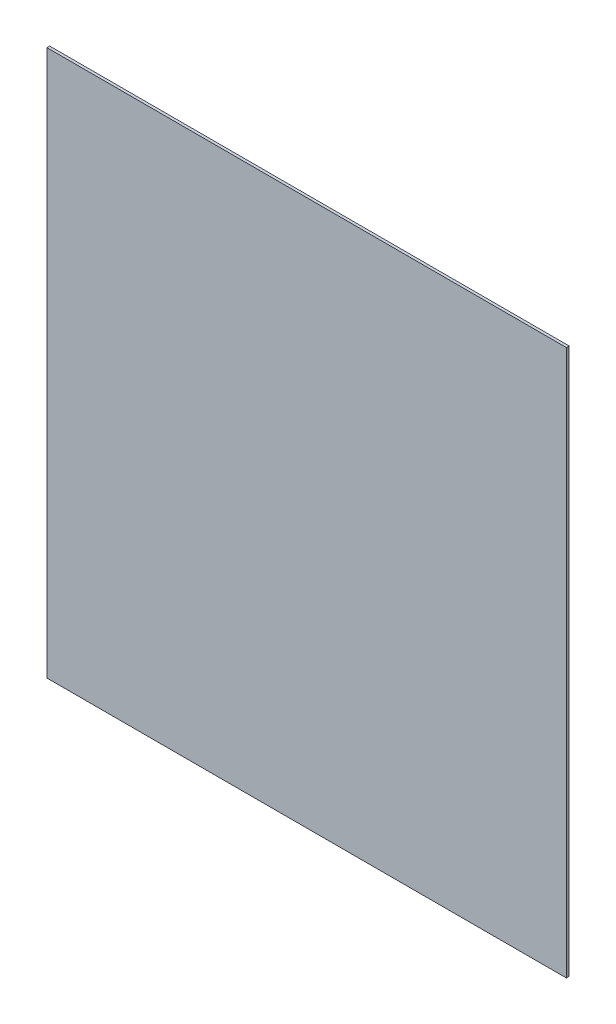
ISO-10303-21;
HEADER;
FILE_DESCRIPTION(('STEP AP214'),'2;1');
FILE_NAME('part.step','',(''),(''),'','','');
FILE_SCHEMA(('AUTOMOTIVE_DESIGN { 1 0 10303 214 1 1 1 1 }'));
ENDSEC;
DATA;
#1=APPLICATION_CONTEXT('core data for automotive mechanical design processes');
#2=APPLICATION_PROTOCOL_DEFINITION('international standard','automotive_design',2000,#1);
#3=PRODUCT_CONTEXT('',#1,'mechanical');
#4=PRODUCT('Part','Part','',(#3));
#5=PRODUCT_RELATED_PRODUCT_CATEGORY('part','',(#4));
#6=PRODUCT_DEFINITION_FORMATION('','',#4);
#7=PRODUCT_DEFINITION_CONTEXT('part definition',#1,'design');
#8=PRODUCT_DEFINITION('design','',#6,#7);
#9=PRODUCT_DEFINITION_SHAPE('','',#8);
#10=(LENGTH_UNIT() NAMED_UNIT(*) SI_UNIT(.MILLI.,.METRE.));
#11=(NAMED_UNIT(*) PLANE_ANGLE_UNIT() SI_UNIT($,.RADIAN.));
#12=(NAMED_UNIT(*) SI_UNIT($,.STERADIAN.) SOLID_ANGLE_UNIT());
#13=UNCERTAINTY_MEASURE_WITH_UNIT(LENGTH_MEASURE(1.E-05),#10,'distance_accuracy_value','');
#14=(GEOMETRIC_REPRESENTATION_CONTEXT(3) GLOBAL_UNCERTAINTY_ASSIGNED_CONTEXT((#13)) GLOBAL_UNIT_ASSIGNED_CONTEXT((#10,
#11,#12)) REPRESENTATION_CONTEXT('',''));
#15=CARTESIAN_POINT('',(0.,0.,0.));
#16=DIRECTION('',(0.,0.,1.));
#17=DIRECTION('',(1.,0.,0.));
#18=AXIS2_PLACEMENT_3D('',#15,#16,#17);
#19=CARTESIAN_POINT('',(-500.,-1008.,-5.));
#20=DIRECTION('',(-1.,0.,0.));
#21=DIRECTION('',(0.,0.,1.));
#22=AXIS2_PLACEMENT_3D('',#19,#20,#21);
#23=PLANE('',#22);
#24=DIRECTION('',(0.,-1.,0.));
#25=VECTOR('',#24,1.);
#26=CARTESIAN_POINT('',(-500.,-1008.,0.));
#27=LINE('',#26,#25);
#28=CARTESIAN_POINT('',(-500.,-8.,0.));
#29=VERTEX_POINT('',#28);
#30=CARTESIAN_POINT('',(-500.,-1008.,0.));
#31=VERTEX_POINT('',#30);
#32=EDGE_CURVE('E95',#29,#31,#27,.T.);
#33=ORIENTED_EDGE('',*,*,#32,.F.);
#34=DIRECTION('',(0.,0.,1.));
#35=VECTOR('',#34,1.);
#36=CARTESIAN_POINT('',(-500.,-8.,-5.));
#37=LINE('',#36,#35);
#38=CARTESIAN_POINT('',(-500.,-8.,-5.));
#39=VERTEX_POINT('',#38);
#40=EDGE_CURVE('E11',#39,#29,#37,.T.);
#41=ORIENTED_EDGE('',*,*,#40,.F.);
#42=DIRECTION('',(0.,-1.,0.));
#43=VECTOR('',#42,1.);
#44=CARTESIAN_POINT('',(-500.,-1008.,-5.));
#45=LINE('',#44,#43);
#46=CARTESIAN_POINT('',(-500.,-1008.,-5.));
#47=VERTEX_POINT('',#46);
#48=EDGE_CURVE('E89',#39,#47,#45,.T.);
#49=ORIENTED_EDGE('',*,*,#48,.T.);
#50=DIRECTION('',(0.,0.,1.));
#51=VECTOR('',#50,1.);
#52=CARTESIAN_POINT('',(-500.,-1008.,-5.));
#53=LINE('',#52,#51);
#54=EDGE_CURVE('E34',#47,#31,#53,.T.);
#55=ORIENTED_EDGE('',*,*,#54,.T.);
#56=EDGE_LOOP('',(#33,#41,#49,#55));
#57=FACE_BOUND('',#56,.T.);
#58=ADVANCED_FACE('F31',(#57),#23,.T.);
#59=CARTESIAN_POINT('',(451.660443770678,-7.99999999999988,-5.));
#60=DIRECTION('',(0.,1.,0.));
#61=DIRECTION('',(-1.,0.,0.));
#62=AXIS2_PLACEMENT_3D('',#59,#60,#61);
#63=PLANE('',#62);
#64=DIRECTION('',(-1.,0.,0.));
#65=VECTOR('',#64,1.);
#66=CARTESIAN_POINT('',(451.660443770678,-7.99999999999988,0.));
#67=LINE('',#66,#65);
#68=CARTESIAN_POINT('',(451.660443770678,-7.99999999999988,0.));
#69=VERTEX_POINT('',#68);
#70=EDGE_CURVE('E91',#69,#29,#67,.T.);
#71=ORIENTED_EDGE('',*,*,#70,.F.);
#72=DIRECTION('',(0.,0.,1.));
#73=VECTOR('',#72,1.);
#74=CARTESIAN_POINT('',(451.660443770678,-7.99999999999988,-5.));
#75=LINE('',#74,#73);
#76=CARTESIAN_POINT('',(451.660443770678,-7.99999999999988,-5.));
#77=VERTEX_POINT('',#76);
#78=EDGE_CURVE('E40',#77,#69,#75,.T.);
#79=ORIENTED_EDGE('',*,*,#78,.F.);
#80=DIRECTION('',(-1.,0.,0.));
#81=VECTOR('',#80,1.);
#82=CARTESIAN_POINT('',(451.660443770678,-7.99999999999988,-5.));
#83=LINE('',#82,#81);
#84=EDGE_CURVE('E86',#77,#39,#83,.T.);
#85=ORIENTED_EDGE('',*,*,#84,.T.);
#86=ORIENTED_EDGE('',*,*,#40,.T.);
#87=EDGE_LOOP('',(#71,#79,#85,#86));
#88=FACE_BOUND('',#87,.T.);
#89=ADVANCED_FACE('F105',(#88),#63,.T.);
#90=CARTESIAN_POINT('',(451.660443770678,-1008.,-5.));
#91=DIRECTION('',(1.,0.,0.));
#92=DIRECTION('',(0.,0.,-1.));
#93=AXIS2_PLACEMENT_3D('',#90,#91,#92);
#94=PLANE('',#93);
#95=DIRECTION('',(0.,1.,0.));
#96=VECTOR('',#95,1.);
#97=CARTESIAN_POINT('',(451.660443770678,-1008.,0.));
#98=LINE('',#97,#96);
#99=CARTESIAN_POINT('',(451.660443770678,-1008.,0.));
#100=VERTEX_POINT('',#99);
#101=EDGE_CURVE('E81',#100,#69,#98,.T.);
#102=ORIENTED_EDGE('',*,*,#101,.F.);
#103=DIRECTION('',(0.,0.,1.));
#104=VECTOR('',#103,1.);
#105=CARTESIAN_POINT('',(451.660443770678,-1008.,-5.));
#106=LINE('',#105,#104);
#107=CARTESIAN_POINT('',(451.660443770678,-1008.,-5.));
#108=VERTEX_POINT('',#107);
#109=EDGE_CURVE('E76',#108,#100,#106,.T.);
#110=ORIENTED_EDGE('',*,*,#109,.F.);
#111=DIRECTION('',(0.,1.,0.));
#112=VECTOR('',#111,1.);
#113=CARTESIAN_POINT('',(451.660443770678,-1008.,-5.));
#114=LINE('',#113,#112);
#115=EDGE_CURVE('E79',#108,#77,#114,.T.);
#116=ORIENTED_EDGE('',*,*,#115,.T.);
#117=ORIENTED_EDGE('',*,*,#78,.T.);
#118=EDGE_LOOP('',(#102,#110,#116,#117));
#119=FACE_BOUND('',#118,.T.);
#120=ADVANCED_FACE('F78',(#119),#94,.T.);
#121=CARTESIAN_POINT('',(451.660443770678,-1008.,-5.));
#122=DIRECTION('',(0.,-1.,0.));
#123=DIRECTION('',(0.,0.,-1.));
#124=AXIS2_PLACEMENT_3D('',#121,#122,#123);
#125=PLANE('',#124);
#126=DIRECTION('',(1.,0.,0.));
#127=VECTOR('',#126,1.);
#128=CARTESIAN_POINT('',(451.660443770678,-1008.,0.));
#129=LINE('',#128,#127);
#130=EDGE_CURVE('E98',#31,#100,#129,.T.);
#131=ORIENTED_EDGE('',*,*,#130,.F.);
#132=ORIENTED_EDGE('',*,*,#54,.F.);
#133=DIRECTION('',(1.,0.,0.));
#134=VECTOR('',#133,1.);
#135=CARTESIAN_POINT('',(451.660443770678,-1008.,-5.));
#136=LINE('',#135,#134);
#137=EDGE_CURVE('E85',#47,#108,#136,.T.);
#138=ORIENTED_EDGE('',*,*,#137,.T.);
#139=ORIENTED_EDGE('',*,*,#109,.T.);
#140=EDGE_LOOP('',(#131,#132,#138,#139));
#141=FACE_BOUND('',#140,.T.);
#142=ADVANCED_FACE('F88',(#141),#125,.T.);
#143=CARTESIAN_POINT('',(-500.,-8.,-5.));
#144=DIRECTION('',(0.,0.,1.));
#145=DIRECTION('',(1.,0.,0.));
#146=AXIS2_PLACEMENT_3D('',#143,#144,#145);
#147=PLANE('',#146);
#148=ORIENTED_EDGE('',*,*,#48,.F.);
#149=ORIENTED_EDGE('',*,*,#84,.F.);
#150=ORIENTED_EDGE('',*,*,#115,.F.);
#151=ORIENTED_EDGE('',*,*,#137,.F.);
#152=EDGE_LOOP('',(#148,#149,#150,#151));
#153=FACE_BOUND('',#152,.T.);
#154=ADVANCED_FACE('F84',(#153),#147,.F.);
#155=CARTESIAN_POINT('',(-500.,-8.,0.));
#156=DIRECTION('',(0.,0.,1.));
#157=DIRECTION('',(1.,0.,0.));
#158=AXIS2_PLACEMENT_3D('',#155,#156,#157);
#159=PLANE('',#158);
#160=ORIENTED_EDGE('',*,*,#32,.T.);
#161=ORIENTED_EDGE('',*,*,#130,.T.);
#162=ORIENTED_EDGE('',*,*,#101,.T.);
#163=ORIENTED_EDGE('',*,*,#70,.T.);
#164=EDGE_LOOP('',(#160,#161,#162,#163));
#165=FACE_BOUND('',#164,.T.);
#166=ADVANCED_FACE('F104',(#165),#159,.T.);
#167=CLOSED_SHELL('',(#58,#89,#120,#142,#154,#166));
#168=MANIFOLD_SOLID_BREP('B2',#167);
#169=ADVANCED_BREP_SHAPE_REPRESENTATION('',(#18,#168),#14);
#170=SHAPE_DEFINITION_REPRESENTATION(#9,#169);
ENDSEC;
END-ISO-10303-21;
